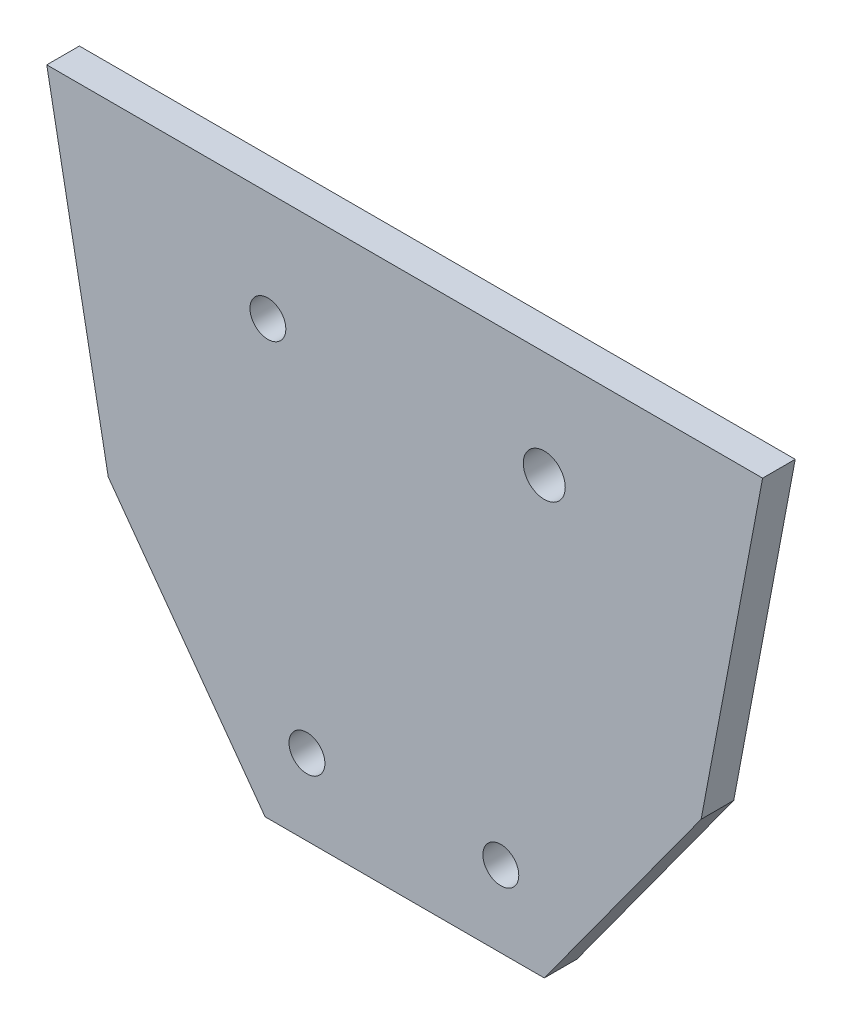
ISO-10303-21;
HEADER;
FILE_DESCRIPTION(('STEP AP214'),'2;1');
FILE_NAME('part.step','',(''),(''),'','','');
FILE_SCHEMA(('AUTOMOTIVE_DESIGN { 1 0 10303 214 1 1 1 1 }'));
ENDSEC;
DATA;
#1=APPLICATION_CONTEXT('core data for automotive mechanical design processes');
#2=APPLICATION_PROTOCOL_DEFINITION('international standard','automotive_design',2000,#1);
#3=PRODUCT_CONTEXT('',#1,'mechanical');
#4=PRODUCT('Part','Part','',(#3));
#5=PRODUCT_RELATED_PRODUCT_CATEGORY('part','',(#4));
#6=PRODUCT_DEFINITION_FORMATION('','',#4);
#7=PRODUCT_DEFINITION_CONTEXT('part definition',#1,'design');
#8=PRODUCT_DEFINITION('design','',#6,#7);
#9=PRODUCT_DEFINITION_SHAPE('','',#8);
#10=(LENGTH_UNIT() NAMED_UNIT(*) SI_UNIT(.MILLI.,.METRE.));
#11=(NAMED_UNIT(*) PLANE_ANGLE_UNIT() SI_UNIT($,.RADIAN.));
#12=(NAMED_UNIT(*) SI_UNIT($,.STERADIAN.) SOLID_ANGLE_UNIT());
#13=UNCERTAINTY_MEASURE_WITH_UNIT(LENGTH_MEASURE(1.E-05),#10,'distance_accuracy_value','');
#14=(GEOMETRIC_REPRESENTATION_CONTEXT(3) GLOBAL_UNCERTAINTY_ASSIGNED_CONTEXT((#13)) GLOBAL_UNIT_ASSIGNED_CONTEXT((#10,
#11,#12)) REPRESENTATION_CONTEXT('',''));
#15=CARTESIAN_POINT('',(0.,0.,0.));
#16=DIRECTION('',(0.,0.,1.));
#17=DIRECTION('',(1.,0.,0.));
#18=AXIS2_PLACEMENT_3D('',#15,#16,#17);
#19=CARTESIAN_POINT('',(0.,0.,3.));
#20=DIRECTION('',(0.,0.,1.));
#21=DIRECTION('',(1.,0.,0.));
#22=AXIS2_PLACEMENT_3D('',#19,#20,#21);
#23=PLANE('',#22);
#24=CARTESIAN_POINT('',(-12.9339641760147,-10.0503844351462,3.));
#25=DIRECTION('',(0.,0.,1.));
#26=DIRECTION('',(1.,0.,0.));
#27=AXIS2_PLACEMENT_3D('',#24,#25,#26);
#28=CIRCLE('',#27,1.65);
#29=CARTESIAN_POINT('',(-11.2839641760147,-10.0503844351462,3.));
#30=VERTEX_POINT('',#29);
#31=EDGE_CURVE('E190',#30,#30,#28,.T.);
#32=ORIENTED_EDGE('',*,*,#31,.F.);
#33=EDGE_LOOP('',(#32));
#34=FACE_BOUND('',#33,.T.);
#35=CARTESIAN_POINT('',(8.49076027719771,-42.8601943949344,3.));
#36=DIRECTION('',(0.,0.,1.));
#37=DIRECTION('',(1.,0.,0.));
#38=AXIS2_PLACEMENT_3D('',#35,#36,#37);
#39=CIRCLE('',#38,1.65);
#40=CARTESIAN_POINT('',(10.1407602771977,-42.8601943949344,3.));
#41=VERTEX_POINT('',#40);
#42=EDGE_CURVE('E123',#41,#41,#39,.T.);
#43=ORIENTED_EDGE('',*,*,#42,.F.);
#44=EDGE_LOOP('',(#43));
#45=FACE_BOUND('',#44,.T.);
#46=DIRECTION('',(0.587784116375069,0.809017819666032,0.));
#47=VECTOR('',#46,1.);
#48=CARTESIAN_POINT('',(12.487583946749,-49.8576824698656,3.));
#49=LINE('',#48,#47);
#50=CARTESIAN_POINT('',(12.487583946749,-49.8576824698656,3.));
#51=VERTEX_POINT('',#50);
#52=CARTESIAN_POINT('',(26.914992169506,-30.,3.));
#53=VERTEX_POINT('',#52);
#54=EDGE_CURVE('E130',#51,#53,#49,.T.);
#55=ORIENTED_EDGE('',*,*,#54,.T.);
#56=DIRECTION('',(0.185187218093569,0.98270325849402,0.));
#57=VECTOR('',#56,1.);
#58=CARTESIAN_POINT('',(26.914992169506,-30.,3.));
#59=LINE('',#58,#57);
#60=CARTESIAN_POINT('',(32.5683941449111,0.,3.));
#61=VERTEX_POINT('',#60);
#62=EDGE_CURVE('E88',#53,#61,#59,.T.);
#63=ORIENTED_EDGE('',*,*,#62,.T.);
#64=DIRECTION('',(-0.999999999990052,-4.46058722844525E-06,0.));
#65=VECTOR('',#64,1.);
#66=CARTESIAN_POINT('',(32.5683941449111,0.,3.));
#67=LINE('',#66,#65);
#68=CARTESIAN_POINT('',(-33.2722399318194,-0.000293687891478323,3.));
#69=VERTEX_POINT('',#68);
#70=EDGE_CURVE('E101',#61,#69,#67,.T.);
#71=ORIENTED_EDGE('',*,*,#70,.T.);
#72=DIRECTION('',(0.185188968845521,-0.98270292856892,0.));
#73=VECTOR('',#72,1.);
#74=CARTESIAN_POINT('',(-27.6188379564144,-30.,3.));
#75=LINE('',#74,#73);
#76=CARTESIAN_POINT('',(-27.6188379564144,-30.,3.));
#77=VERTEX_POINT('',#76);
#78=EDGE_CURVE('E95',#69,#77,#75,.T.);
#79=ORIENTED_EDGE('',*,*,#78,.T.);
#80=DIRECTION('',(0.587784116375068,-0.809017819666032,0.));
#81=VECTOR('',#80,1.);
#82=CARTESIAN_POINT('',(-13.1914297336574,-49.8576824698656,3.));
#83=LINE('',#82,#81);
#84=CARTESIAN_POINT('',(-13.1914297336574,-49.8576824698656,3.));
#85=VERTEX_POINT('',#84);
#86=EDGE_CURVE('E99',#77,#85,#83,.T.);
#87=ORIENTED_EDGE('',*,*,#86,.T.);
#88=DIRECTION('',(1.,0.,0.));
#89=VECTOR('',#88,1.);
#90=CARTESIAN_POINT('',(-13.1914297336574,-49.8576824698656,3.));
#91=LINE('',#90,#89);
#92=EDGE_CURVE('E51',#85,#51,#91,.T.);
#93=ORIENTED_EDGE('',*,*,#92,.T.);
#94=EDGE_LOOP('',(#55,#63,#71,#79,#87,#93));
#95=FACE_BOUND('',#94,.T.);
#96=CARTESIAN_POINT('',(-9.34272850695246,-42.8601943949346,3.));
#97=DIRECTION('',(0.,0.,1.));
#98=DIRECTION('',(1.,0.,0.));
#99=AXIS2_PLACEMENT_3D('',#96,#97,#98);
#100=CIRCLE('',#99,1.65);
#101=CARTESIAN_POINT('',(-7.69272850695246,-42.8601943949346,3.));
#102=VERTEX_POINT('',#101);
#103=EDGE_CURVE('E196',#102,#102,#100,.T.);
#104=ORIENTED_EDGE('',*,*,#103,.F.);
#105=EDGE_LOOP('',(#104));
#106=FACE_BOUND('',#105,.T.);
#107=CARTESIAN_POINT('',(12.487583946749,-9.80768246986555,3.));
#108=DIRECTION('',(0.,0.,1.));
#109=DIRECTION('',(1.,0.,0.));
#110=AXIS2_PLACEMENT_3D('',#107,#108,#109);
#111=CIRCLE('',#110,1.92941435921609);
#112=CARTESIAN_POINT('',(14.4169983059651,-9.80768246986555,3.));
#113=VERTEX_POINT('',#112);
#114=EDGE_CURVE('E181',#113,#113,#111,.T.);
#115=ORIENTED_EDGE('',*,*,#114,.F.);
#116=EDGE_LOOP('',(#115));
#117=FACE_BOUND('',#116,.T.);
#118=ADVANCED_FACE('F34',(#34,#45,#95,#106,#117),#23,.T.);
#119=CARTESIAN_POINT('',(0.,0.,0.));
#120=DIRECTION('',(0.,0.,1.));
#121=DIRECTION('',(1.,0.,0.));
#122=AXIS2_PLACEMENT_3D('',#119,#120,#121);
#123=PLANE('',#122);
#124=DIRECTION('',(0.587784116375069,0.809017819666032,0.));
#125=VECTOR('',#124,1.);
#126=CARTESIAN_POINT('',(12.487583946749,-49.8576824698656,0.));
#127=LINE('',#126,#125);
#128=CARTESIAN_POINT('',(12.487583946749,-49.8576824698656,0.));
#129=VERTEX_POINT('',#128);
#130=CARTESIAN_POINT('',(26.914992169506,-30.,0.));
#131=VERTEX_POINT('',#130);
#132=EDGE_CURVE('E119',#129,#131,#127,.T.);
#133=ORIENTED_EDGE('',*,*,#132,.F.);
#134=DIRECTION('',(1.,0.,0.));
#135=VECTOR('',#134,1.);
#136=CARTESIAN_POINT('',(-13.1914297336574,-49.8576824698656,0.));
#137=LINE('',#136,#135);
#138=CARTESIAN_POINT('',(-13.1914297336574,-49.8576824698656,0.));
#139=VERTEX_POINT('',#138);
#140=EDGE_CURVE('E80',#139,#129,#137,.T.);
#141=ORIENTED_EDGE('',*,*,#140,.F.);
#142=DIRECTION('',(0.587784116375068,-0.809017819666032,0.));
#143=VECTOR('',#142,1.);
#144=CARTESIAN_POINT('',(-13.1914297336574,-49.8576824698656,0.));
#145=LINE('',#144,#143);
#146=CARTESIAN_POINT('',(-27.6188379564144,-30.,0.));
#147=VERTEX_POINT('',#146);
#148=EDGE_CURVE('E74',#147,#139,#145,.T.);
#149=ORIENTED_EDGE('',*,*,#148,.F.);
#150=DIRECTION('',(0.185188968845521,-0.98270292856892,0.));
#151=VECTOR('',#150,1.);
#152=CARTESIAN_POINT('',(-27.6188379564144,-30.,0.));
#153=LINE('',#152,#151);
#154=CARTESIAN_POINT('',(-33.2722399318194,-0.000293687891478323,0.));
#155=VERTEX_POINT('',#154);
#156=EDGE_CURVE('E109',#155,#147,#153,.T.);
#157=ORIENTED_EDGE('',*,*,#156,.F.);
#158=DIRECTION('',(-0.999999999990052,-4.46058722844525E-06,0.));
#159=VECTOR('',#158,1.);
#160=CARTESIAN_POINT('',(32.5683941449111,0.,0.));
#161=LINE('',#160,#159);
#162=CARTESIAN_POINT('',(32.5683941449111,0.,0.));
#163=VERTEX_POINT('',#162);
#164=EDGE_CURVE('E125',#163,#155,#161,.T.);
#165=ORIENTED_EDGE('',*,*,#164,.F.);
#166=DIRECTION('',(0.185187218093569,0.98270325849402,0.));
#167=VECTOR('',#166,1.);
#168=CARTESIAN_POINT('',(26.914992169506,-30.,0.));
#169=LINE('',#168,#167);
#170=EDGE_CURVE('E122',#131,#163,#169,.T.);
#171=ORIENTED_EDGE('',*,*,#170,.F.);
#172=EDGE_LOOP('',(#133,#141,#149,#157,#165,#171));
#173=FACE_BOUND('',#172,.T.);
#174=CARTESIAN_POINT('',(8.49076027719771,-42.8601943949344,0.));
#175=DIRECTION('',(0.,0.,1.));
#176=DIRECTION('',(1.,0.,0.));
#177=AXIS2_PLACEMENT_3D('',#174,#175,#176);
#178=CIRCLE('',#177,1.65);
#179=CARTESIAN_POINT('',(10.1407602771977,-42.8601943949344,0.));
#180=VERTEX_POINT('',#179);
#181=EDGE_CURVE('E199',#180,#180,#178,.T.);
#182=ORIENTED_EDGE('',*,*,#181,.T.);
#183=EDGE_LOOP('',(#182));
#184=FACE_BOUND('',#183,.T.);
#185=CARTESIAN_POINT('',(-9.34272850695246,-42.8601943949346,0.));
#186=DIRECTION('',(0.,0.,1.));
#187=DIRECTION('',(1.,0.,0.));
#188=AXIS2_PLACEMENT_3D('',#185,#186,#187);
#189=CIRCLE('',#188,1.65);
#190=CARTESIAN_POINT('',(-7.69272850695246,-42.8601943949346,0.));
#191=VERTEX_POINT('',#190);
#192=EDGE_CURVE('E193',#191,#191,#189,.T.);
#193=ORIENTED_EDGE('',*,*,#192,.T.);
#194=EDGE_LOOP('',(#193));
#195=FACE_BOUND('',#194,.T.);
#196=CARTESIAN_POINT('',(-12.9339641760147,-10.0503844351462,0.));
#197=DIRECTION('',(0.,0.,1.));
#198=DIRECTION('',(1.,0.,0.));
#199=AXIS2_PLACEMENT_3D('',#196,#197,#198);
#200=CIRCLE('',#199,1.65);
#201=CARTESIAN_POINT('',(-11.2839641760147,-10.0503844351462,0.));
#202=VERTEX_POINT('',#201);
#203=EDGE_CURVE('E187',#202,#202,#200,.T.);
#204=ORIENTED_EDGE('',*,*,#203,.T.);
#205=EDGE_LOOP('',(#204));
#206=FACE_BOUND('',#205,.T.);
#207=CARTESIAN_POINT('',(12.487583946749,-9.80768246986555,0.));
#208=DIRECTION('',(0.,0.,1.));
#209=DIRECTION('',(1.,0.,0.));
#210=AXIS2_PLACEMENT_3D('',#207,#208,#209);
#211=CIRCLE('',#210,1.92941435921609);
#212=CARTESIAN_POINT('',(14.4169983059651,-9.80768246986555,0.));
#213=VERTEX_POINT('',#212);
#214=EDGE_CURVE('E184',#213,#213,#211,.T.);
#215=ORIENTED_EDGE('',*,*,#214,.T.);
#216=EDGE_LOOP('',(#215));
#217=FACE_BOUND('',#216,.T.);
#218=ADVANCED_FACE('F139',(#173,#184,#195,#206,#217),#123,.F.);
#219=CARTESIAN_POINT('',(12.487583946749,-49.8576824698656,3.));
#220=DIRECTION('',(-0.809017819666032,0.587784116375069,0.));
#221=DIRECTION('',(-0.587784116375069,-0.809017819666032,0.));
#222=AXIS2_PLACEMENT_3D('',#219,#220,#221);
#223=PLANE('',#222);
#224=ORIENTED_EDGE('',*,*,#132,.T.);
#225=DIRECTION('',(0.,0.,-1.));
#226=VECTOR('',#225,1.);
#227=CARTESIAN_POINT('',(26.914992169506,-30.,3.));
#228=LINE('',#227,#226);
#229=EDGE_CURVE('E11',#53,#131,#228,.T.);
#230=ORIENTED_EDGE('',*,*,#229,.F.);
#231=ORIENTED_EDGE('',*,*,#54,.F.);
#232=DIRECTION('',(0.,0.,-1.));
#233=VECTOR('',#232,1.);
#234=CARTESIAN_POINT('',(12.487583946749,-49.8576824698656,3.));
#235=LINE('',#234,#233);
#236=EDGE_CURVE('E115',#51,#129,#235,.T.);
#237=ORIENTED_EDGE('',*,*,#236,.T.);
#238=EDGE_LOOP('',(#224,#230,#231,#237));
#239=FACE_BOUND('',#238,.T.);
#240=ADVANCED_FACE('F36',(#239),#223,.F.);
#241=CARTESIAN_POINT('',(26.914992169506,-30.,3.));
#242=DIRECTION('',(-0.98270325849402,0.185187218093569,0.));
#243=DIRECTION('',(-0.185187218093569,-0.98270325849402,0.));
#244=AXIS2_PLACEMENT_3D('',#241,#242,#243);
#245=PLANE('',#244);
#246=ORIENTED_EDGE('',*,*,#170,.T.);
#247=DIRECTION('',(0.,0.,-1.));
#248=VECTOR('',#247,1.);
#249=CARTESIAN_POINT('',(32.5683941449111,0.,3.));
#250=LINE('',#249,#248);
#251=EDGE_CURVE('E43',#61,#163,#250,.T.);
#252=ORIENTED_EDGE('',*,*,#251,.F.);
#253=ORIENTED_EDGE('',*,*,#62,.F.);
#254=ORIENTED_EDGE('',*,*,#229,.T.);
#255=EDGE_LOOP('',(#246,#252,#253,#254));
#256=FACE_BOUND('',#255,.T.);
#257=ADVANCED_FACE('F257',(#256),#245,.F.);
#258=CARTESIAN_POINT('',(32.5683941449111,0.,3.));
#259=DIRECTION('',(4.46058722844525E-06,-0.999999999990051,0.));
#260=DIRECTION('',(0.999999999990052,4.46058722844525E-06,0.));
#261=AXIS2_PLACEMENT_3D('',#258,#259,#260);
#262=PLANE('',#261);
#263=ORIENTED_EDGE('',*,*,#164,.T.);
#264=DIRECTION('',(0.,0.,-1.));
#265=VECTOR('',#264,1.);
#266=CARTESIAN_POINT('',(-33.2722399318194,-0.000293687891478323,3.));
#267=LINE('',#266,#265);
#268=EDGE_CURVE('E110',#69,#155,#267,.T.);
#269=ORIENTED_EDGE('',*,*,#268,.F.);
#270=ORIENTED_EDGE('',*,*,#70,.F.);
#271=ORIENTED_EDGE('',*,*,#251,.T.);
#272=EDGE_LOOP('',(#263,#269,#270,#271));
#273=FACE_BOUND('',#272,.T.);
#274=ADVANCED_FACE('F136',(#273),#262,.F.);
#275=CARTESIAN_POINT('',(-27.6188379564144,-30.,3.));
#276=DIRECTION('',(0.98270292856892,0.185188968845521,0.));
#277=DIRECTION('',(-0.185188968845521,0.982702928568921,0.));
#278=AXIS2_PLACEMENT_3D('',#275,#276,#277);
#279=PLANE('',#278);
#280=ORIENTED_EDGE('',*,*,#156,.T.);
#281=DIRECTION('',(0.,0.,-1.));
#282=VECTOR('',#281,1.);
#283=CARTESIAN_POINT('',(-27.6188379564144,-30.,3.));
#284=LINE('',#283,#282);
#285=EDGE_CURVE('E106',#77,#147,#284,.T.);
#286=ORIENTED_EDGE('',*,*,#285,.F.);
#287=ORIENTED_EDGE('',*,*,#78,.F.);
#288=ORIENTED_EDGE('',*,*,#268,.T.);
#289=EDGE_LOOP('',(#280,#286,#287,#288));
#290=FACE_BOUND('',#289,.T.);
#291=ADVANCED_FACE('F107',(#290),#279,.F.);
#292=CARTESIAN_POINT('',(-13.1914297336574,-49.8576824698656,3.));
#293=DIRECTION('',(0.809017819666032,0.587784116375069,0.));
#294=DIRECTION('',(-0.587784116375068,0.809017819666032,0.));
#295=AXIS2_PLACEMENT_3D('',#292,#293,#294);
#296=PLANE('',#295);
#297=ORIENTED_EDGE('',*,*,#148,.T.);
#298=DIRECTION('',(0.,0.,-1.));
#299=VECTOR('',#298,1.);
#300=CARTESIAN_POINT('',(-13.1914297336574,-49.8576824698656,3.));
#301=LINE('',#300,#299);
#302=EDGE_CURVE('E111',#85,#139,#301,.T.);
#303=ORIENTED_EDGE('',*,*,#302,.F.);
#304=ORIENTED_EDGE('',*,*,#86,.F.);
#305=ORIENTED_EDGE('',*,*,#285,.T.);
#306=EDGE_LOOP('',(#297,#303,#304,#305));
#307=FACE_BOUND('',#306,.T.);
#308=ADVANCED_FACE('F113',(#307),#296,.F.);
#309=CARTESIAN_POINT('',(-13.1914297336574,-49.8576824698656,3.));
#310=DIRECTION('',(0.,1.,0.));
#311=DIRECTION('',(0.,0.,1.));
#312=AXIS2_PLACEMENT_3D('',#309,#310,#311);
#313=PLANE('',#312);
#314=ORIENTED_EDGE('',*,*,#140,.T.);
#315=ORIENTED_EDGE('',*,*,#236,.F.);
#316=ORIENTED_EDGE('',*,*,#92,.F.);
#317=ORIENTED_EDGE('',*,*,#302,.T.);
#318=EDGE_LOOP('',(#314,#315,#316,#317));
#319=FACE_BOUND('',#318,.T.);
#320=ADVANCED_FACE('F144',(#319),#313,.F.);
#321=CARTESIAN_POINT('',(8.49076027719771,-42.8601943949344,3.));
#322=DIRECTION('',(0.,0.,-1.));
#323=DIRECTION('',(-1.,0.,0.));
#324=AXIS2_PLACEMENT_3D('',#321,#322,#323);
#325=CYLINDRICAL_SURFACE('',#324,1.65);
#326=ORIENTED_EDGE('',*,*,#42,.T.);
#327=EDGE_LOOP('',(#326));
#328=FACE_BOUND('',#327,.T.);
#329=ORIENTED_EDGE('',*,*,#181,.F.);
#330=EDGE_LOOP('',(#329));
#331=FACE_BOUND('',#330,.T.);
#332=ADVANCED_FACE('F146',(#328,#331),#325,.F.);
#333=CARTESIAN_POINT('',(-9.34272850695246,-42.8601943949346,3.));
#334=DIRECTION('',(0.,0.,-1.));
#335=DIRECTION('',(-1.,0.,0.));
#336=AXIS2_PLACEMENT_3D('',#333,#334,#335);
#337=CYLINDRICAL_SURFACE('',#336,1.65);
#338=ORIENTED_EDGE('',*,*,#103,.T.);
#339=EDGE_LOOP('',(#338));
#340=FACE_BOUND('',#339,.T.);
#341=ORIENTED_EDGE('',*,*,#192,.F.);
#342=EDGE_LOOP('',(#341));
#343=FACE_BOUND('',#342,.T.);
#344=ADVANCED_FACE('F152',(#340,#343),#337,.F.);
#345=CARTESIAN_POINT('',(-12.9339641760147,-10.0503844351462,3.));
#346=DIRECTION('',(0.,0.,-1.));
#347=DIRECTION('',(-1.,0.,0.));
#348=AXIS2_PLACEMENT_3D('',#345,#346,#347);
#349=CYLINDRICAL_SURFACE('',#348,1.65);
#350=ORIENTED_EDGE('',*,*,#31,.T.);
#351=EDGE_LOOP('',(#350));
#352=FACE_BOUND('',#351,.T.);
#353=ORIENTED_EDGE('',*,*,#203,.F.);
#354=EDGE_LOOP('',(#353));
#355=FACE_BOUND('',#354,.T.);
#356=ADVANCED_FACE('F168',(#352,#355),#349,.F.);
#357=CARTESIAN_POINT('',(12.487583946749,-9.80768246986555,3.));
#358=DIRECTION('',(0.,0.,-1.));
#359=DIRECTION('',(-1.,0.,0.));
#360=AXIS2_PLACEMENT_3D('',#357,#358,#359);
#361=CYLINDRICAL_SURFACE('',#360,1.92941435921609);
#362=ORIENTED_EDGE('',*,*,#114,.T.);
#363=EDGE_LOOP('',(#362));
#364=FACE_BOUND('',#363,.T.);
#365=ORIENTED_EDGE('',*,*,#214,.F.);
#366=EDGE_LOOP('',(#365));
#367=FACE_BOUND('',#366,.T.);
#368=ADVANCED_FACE('F172',(#364,#367),#361,.F.);
#369=CLOSED_SHELL('',(#118,#218,#240,#257,#274,#291,#308,#320,#332,#344,#356,#368));
#370=MANIFOLD_SOLID_BREP('B2',#369);
#371=ADVANCED_BREP_SHAPE_REPRESENTATION('',(#18,#370),#14);
#372=SHAPE_DEFINITION_REPRESENTATION(#9,#371);
ENDSEC;
END-ISO-10303-21;
